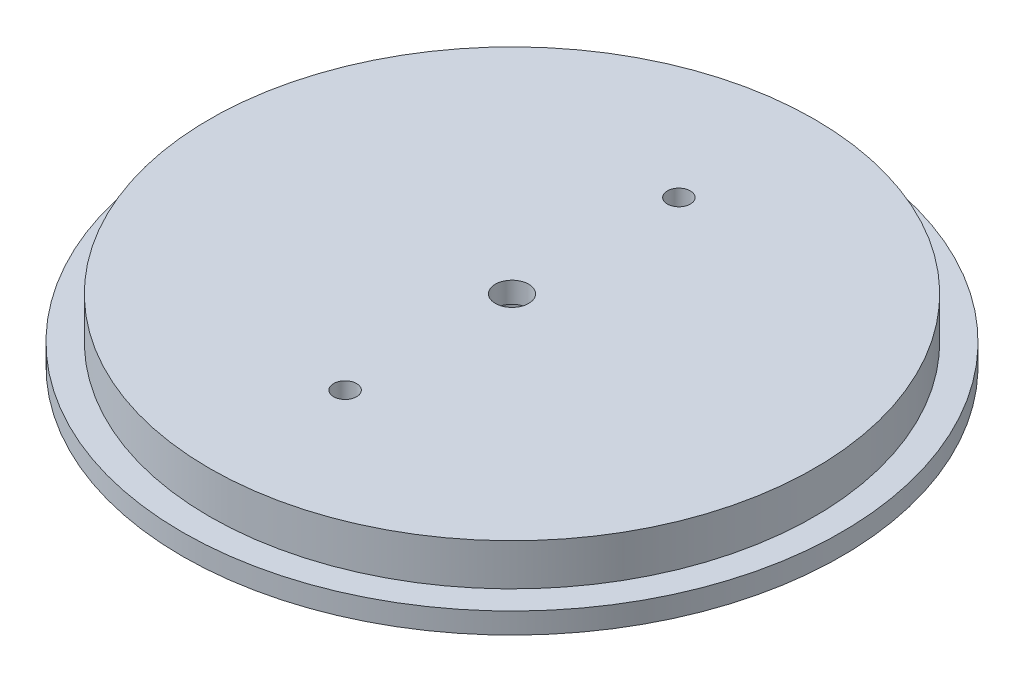
ISO-10303-21;
HEADER;
FILE_DESCRIPTION(('STEP AP214'),'2;1');
FILE_NAME('part.step','',(''),(''),'','','');
FILE_SCHEMA(('AUTOMOTIVE_DESIGN { 1 0 10303 214 1 1 1 1 }'));
ENDSEC;
DATA;
#1=APPLICATION_CONTEXT('core data for automotive mechanical design processes');
#2=APPLICATION_PROTOCOL_DEFINITION('international standard','automotive_design',2000,#1);
#3=PRODUCT_CONTEXT('',#1,'mechanical');
#4=PRODUCT('Part','Part','',(#3));
#5=PRODUCT_RELATED_PRODUCT_CATEGORY('part','',(#4));
#6=PRODUCT_DEFINITION_FORMATION('','',#4);
#7=PRODUCT_DEFINITION_CONTEXT('part definition',#1,'design');
#8=PRODUCT_DEFINITION('design','',#6,#7);
#9=PRODUCT_DEFINITION_SHAPE('','',#8);
#10=(LENGTH_UNIT() NAMED_UNIT(*) SI_UNIT(.MILLI.,.METRE.));
#11=(NAMED_UNIT(*) PLANE_ANGLE_UNIT() SI_UNIT($,.RADIAN.));
#12=(NAMED_UNIT(*) SI_UNIT($,.STERADIAN.) SOLID_ANGLE_UNIT());
#13=UNCERTAINTY_MEASURE_WITH_UNIT(LENGTH_MEASURE(1.E-05),#10,'distance_accuracy_value','');
#14=(GEOMETRIC_REPRESENTATION_CONTEXT(3) GLOBAL_UNCERTAINTY_ASSIGNED_CONTEXT((#13)) GLOBAL_UNIT_ASSIGNED_CONTEXT((#10,
#11,#12)) REPRESENTATION_CONTEXT('',''));
#15=CARTESIAN_POINT('',(0.,0.,0.));
#16=DIRECTION('',(0.,0.,1.));
#17=DIRECTION('',(1.,0.,0.));
#18=AXIS2_PLACEMENT_3D('',#15,#16,#17);
#19=CARTESIAN_POINT('',(0.,5.,0.));
#20=DIRECTION('',(0.,-1.,0.));
#21=DIRECTION('',(0.,0.,-1.));
#22=AXIS2_PLACEMENT_3D('',#19,#20,#21);
#23=CYLINDRICAL_SURFACE('',#22,79.);
#24=CARTESIAN_POINT('',(0.,5.,0.));
#25=DIRECTION('',(0.,1.,0.));
#26=DIRECTION('',(0.,0.,1.));
#27=AXIS2_PLACEMENT_3D('',#24,#25,#26);
#28=CIRCLE('',#27,79.);
#29=CARTESIAN_POINT('',(0.,5.,79.));
#30=VERTEX_POINT('',#29);
#31=EDGE_CURVE('E51',#30,#30,#28,.T.);
#32=ORIENTED_EDGE('',*,*,#31,.F.);
#33=EDGE_LOOP('',(#32));
#34=FACE_BOUND('',#33,.T.);
#35=CARTESIAN_POINT('',(0.,0.,0.));
#36=DIRECTION('',(0.,1.,0.));
#37=DIRECTION('',(0.,0.,1.));
#38=AXIS2_PLACEMENT_3D('',#35,#36,#37);
#39=CIRCLE('',#38,79.);
#40=CARTESIAN_POINT('',(0.,0.,79.));
#41=VERTEX_POINT('',#40);
#42=EDGE_CURVE('E46',#41,#41,#39,.T.);
#43=ORIENTED_EDGE('',*,*,#42,.T.);
#44=EDGE_LOOP('',(#43));
#45=FACE_BOUND('',#44,.T.);
#46=ADVANCED_FACE('F43',(#34,#45),#23,.T.);
#47=CARTESIAN_POINT('',(0.,5.,0.));
#48=DIRECTION('',(0.,1.,0.));
#49=DIRECTION('',(0.,0.,1.));
#50=AXIS2_PLACEMENT_3D('',#47,#48,#49);
#51=PLANE('',#50);
#52=CARTESIAN_POINT('',(0.,5.,0.));
#53=DIRECTION('',(0.,1.,0.));
#54=DIRECTION('',(0.,0.,1.));
#55=AXIS2_PLACEMENT_3D('',#52,#53,#54);
#56=CIRCLE('',#55,72.5);
#57=CARTESIAN_POINT('',(0.,5.,72.5));
#58=VERTEX_POINT('',#57);
#59=EDGE_CURVE('E10',#58,#58,#56,.T.);
#60=ORIENTED_EDGE('',*,*,#59,.F.);
#61=EDGE_LOOP('',(#60));
#62=FACE_BOUND('',#61,.T.);
#63=ORIENTED_EDGE('',*,*,#31,.T.);
#64=EDGE_LOOP('',(#63));
#65=FACE_BOUND('',#64,.T.);
#66=ADVANCED_FACE('F108',(#62,#65),#51,.T.);
#67=CARTESIAN_POINT('',(0.,0.,0.));
#68=DIRECTION('',(0.,1.,0.));
#69=DIRECTION('',(0.,0.,1.));
#70=AXIS2_PLACEMENT_3D('',#67,#68,#69);
#71=PLANE('',#70);
#72=CARTESIAN_POINT('',(0.,0.,0.));
#73=DIRECTION('',(0.,-1.,0.));
#74=DIRECTION('',(0.,0.,-1.));
#75=AXIS2_PLACEMENT_3D('',#72,#73,#74);
#76=CIRCLE('',#75,6.);
#77=CARTESIAN_POINT('',(0.,0.,-6.));
#78=VERTEX_POINT('',#77);
#79=EDGE_CURVE('E87',#78,#78,#76,.T.);
#80=ORIENTED_EDGE('',*,*,#79,.F.);
#81=EDGE_LOOP('',(#80));
#82=FACE_BOUND('',#81,.T.);
#83=CARTESIAN_POINT('',(0.,0.,-40.));
#84=DIRECTION('',(0.,1.,0.));
#85=DIRECTION('',(0.,0.,1.));
#86=AXIS2_PLACEMENT_3D('',#83,#84,#85);
#87=CIRCLE('',#86,2.75);
#88=CARTESIAN_POINT('',(0.,0.,-37.25));
#89=VERTEX_POINT('',#88);
#90=EDGE_CURVE('E62',#89,#89,#87,.T.);
#91=ORIENTED_EDGE('',*,*,#90,.T.);
#92=EDGE_LOOP('',(#91));
#93=FACE_BOUND('',#92,.T.);
#94=CARTESIAN_POINT('',(0.,0.,40.));
#95=DIRECTION('',(0.,1.,0.));
#96=DIRECTION('',(0.,0.,1.));
#97=AXIS2_PLACEMENT_3D('',#94,#95,#96);
#98=CIRCLE('',#97,2.75);
#99=CARTESIAN_POINT('',(0.,0.,42.75));
#100=VERTEX_POINT('',#99);
#101=EDGE_CURVE('E63',#100,#100,#98,.T.);
#102=ORIENTED_EDGE('',*,*,#101,.T.);
#103=EDGE_LOOP('',(#102));
#104=FACE_BOUND('',#103,.T.);
#105=ORIENTED_EDGE('',*,*,#42,.F.);
#106=EDGE_LOOP('',(#105));
#107=FACE_BOUND('',#106,.T.);
#108=ADVANCED_FACE('F104',(#82,#93,#104,#107),#71,.F.);
#109=CARTESIAN_POINT('',(0.,15.,0.));
#110=DIRECTION('',(0.,-1.,0.));
#111=DIRECTION('',(0.,0.,-1.));
#112=AXIS2_PLACEMENT_3D('',#109,#110,#111);
#113=CYLINDRICAL_SURFACE('',#112,72.5);
#114=CARTESIAN_POINT('',(0.,15.,0.));
#115=DIRECTION('',(0.,1.,0.));
#116=DIRECTION('',(0.,0.,1.));
#117=AXIS2_PLACEMENT_3D('',#114,#115,#116);
#118=CIRCLE('',#117,72.5);
#119=CARTESIAN_POINT('',(0.,15.,72.5));
#120=VERTEX_POINT('',#119);
#121=EDGE_CURVE('E58',#120,#120,#118,.T.);
#122=ORIENTED_EDGE('',*,*,#121,.F.);
#123=EDGE_LOOP('',(#122));
#124=FACE_BOUND('',#123,.T.);
#125=ORIENTED_EDGE('',*,*,#59,.T.);
#126=EDGE_LOOP('',(#125));
#127=FACE_BOUND('',#126,.T.);
#128=ADVANCED_FACE('F107',(#124,#127),#113,.T.);
#129=CARTESIAN_POINT('',(0.,15.,0.));
#130=DIRECTION('',(0.,1.,0.));
#131=DIRECTION('',(0.,0.,1.));
#132=AXIS2_PLACEMENT_3D('',#129,#130,#131);
#133=PLANE('',#132);
#134=CARTESIAN_POINT('',(0.,15.,0.));
#135=DIRECTION('',(0.,1.,0.));
#136=DIRECTION('',(0.,0.,1.));
#137=AXIS2_PLACEMENT_3D('',#134,#135,#136);
#138=CIRCLE('',#137,4.);
#139=CARTESIAN_POINT('',(0.,15.,4.));
#140=VERTEX_POINT('',#139);
#141=EDGE_CURVE('E68',#140,#140,#138,.T.);
#142=ORIENTED_EDGE('',*,*,#141,.F.);
#143=EDGE_LOOP('',(#142));
#144=FACE_BOUND('',#143,.T.);
#145=CARTESIAN_POINT('',(0.,15.,-40.));
#146=DIRECTION('',(0.,1.,0.));
#147=DIRECTION('',(0.,0.,1.));
#148=AXIS2_PLACEMENT_3D('',#145,#146,#147);
#149=CIRCLE('',#148,2.75);
#150=CARTESIAN_POINT('',(0.,15.,-37.25));
#151=VERTEX_POINT('',#150);
#152=EDGE_CURVE('E72',#151,#151,#149,.T.);
#153=ORIENTED_EDGE('',*,*,#152,.F.);
#154=EDGE_LOOP('',(#153));
#155=FACE_BOUND('',#154,.T.);
#156=CARTESIAN_POINT('',(0.,15.,40.));
#157=DIRECTION('',(0.,1.,0.));
#158=DIRECTION('',(0.,0.,1.));
#159=AXIS2_PLACEMENT_3D('',#156,#157,#158);
#160=CIRCLE('',#159,2.75);
#161=CARTESIAN_POINT('',(0.,15.,42.75));
#162=VERTEX_POINT('',#161);
#163=EDGE_CURVE('E67',#162,#162,#160,.T.);
#164=ORIENTED_EDGE('',*,*,#163,.F.);
#165=EDGE_LOOP('',(#164));
#166=FACE_BOUND('',#165,.T.);
#167=ORIENTED_EDGE('',*,*,#121,.T.);
#168=EDGE_LOOP('',(#167));
#169=FACE_BOUND('',#168,.T.);
#170=ADVANCED_FACE('F131',(#144,#155,#166,#169),#133,.T.);
#171=CARTESIAN_POINT('',(0.,0.,40.));
#172=DIRECTION('',(0.,1.,0.));
#173=DIRECTION('',(0.,0.,1.));
#174=AXIS2_PLACEMENT_3D('',#171,#172,#173);
#175=CYLINDRICAL_SURFACE('',#174,2.75);
#176=ORIENTED_EDGE('',*,*,#101,.F.);
#177=EDGE_LOOP('',(#176));
#178=FACE_BOUND('',#177,.T.);
#179=ORIENTED_EDGE('',*,*,#163,.T.);
#180=EDGE_LOOP('',(#179));
#181=FACE_BOUND('',#180,.T.);
#182=ADVANCED_FACE('F135',(#178,#181),#175,.F.);
#183=CARTESIAN_POINT('',(0.,0.,-40.));
#184=DIRECTION('',(0.,1.,0.));
#185=DIRECTION('',(0.,0.,1.));
#186=AXIS2_PLACEMENT_3D('',#183,#184,#185);
#187=CYLINDRICAL_SURFACE('',#186,2.75);
#188=ORIENTED_EDGE('',*,*,#90,.F.);
#189=EDGE_LOOP('',(#188));
#190=FACE_BOUND('',#189,.T.);
#191=ORIENTED_EDGE('',*,*,#152,.T.);
#192=EDGE_LOOP('',(#191));
#193=FACE_BOUND('',#192,.T.);
#194=ADVANCED_FACE('F139',(#190,#193),#187,.F.);
#195=CARTESIAN_POINT('',(0.,10.,0.));
#196=DIRECTION('',(0.,1.,0.));
#197=DIRECTION('',(0.,0.,1.));
#198=AXIS2_PLACEMENT_3D('',#195,#196,#197);
#199=CYLINDRICAL_SURFACE('',#198,4.);
#200=CARTESIAN_POINT('',(0.,10.,0.));
#201=DIRECTION('',(0.,1.,0.));
#202=DIRECTION('',(0.,0.,1.));
#203=AXIS2_PLACEMENT_3D('',#200,#201,#202);
#204=CIRCLE('',#203,4.);
#205=CARTESIAN_POINT('',(0.,10.,4.));
#206=VERTEX_POINT('',#205);
#207=EDGE_CURVE('E82',#206,#206,#204,.T.);
#208=ORIENTED_EDGE('',*,*,#207,.F.);
#209=EDGE_LOOP('',(#208));
#210=FACE_BOUND('',#209,.T.);
#211=ORIENTED_EDGE('',*,*,#141,.T.);
#212=EDGE_LOOP('',(#211));
#213=FACE_BOUND('',#212,.T.);
#214=ADVANCED_FACE('F143',(#210,#213),#199,.F.);
#215=CARTESIAN_POINT('',(0.,10.,0.));
#216=DIRECTION('',(0.,-1.,0.));
#217=DIRECTION('',(0.,0.,-1.));
#218=AXIS2_PLACEMENT_3D('',#215,#216,#217);
#219=PLANE('',#218);
#220=CARTESIAN_POINT('',(0.,10.,0.));
#221=DIRECTION('',(0.,-1.,0.));
#222=DIRECTION('',(0.,0.,-1.));
#223=AXIS2_PLACEMENT_3D('',#220,#221,#222);
#224=CIRCLE('',#223,6.);
#225=CARTESIAN_POINT('',(0.,10.,-6.));
#226=VERTEX_POINT('',#225);
#227=EDGE_CURVE('E86',#226,#226,#224,.T.);
#228=ORIENTED_EDGE('',*,*,#227,.T.);
#229=EDGE_LOOP('',(#228));
#230=FACE_BOUND('',#229,.T.);
#231=ORIENTED_EDGE('',*,*,#207,.T.);
#232=EDGE_LOOP('',(#231));
#233=FACE_BOUND('',#232,.T.);
#234=ADVANCED_FACE('F95',(#230,#233),#219,.T.);
#235=CARTESIAN_POINT('',(0.,10.,0.));
#236=DIRECTION('',(0.,-1.,0.));
#237=DIRECTION('',(0.,0.,-1.));
#238=AXIS2_PLACEMENT_3D('',#235,#236,#237);
#239=CYLINDRICAL_SURFACE('',#238,6.);
#240=ORIENTED_EDGE('',*,*,#227,.F.);
#241=EDGE_LOOP('',(#240));
#242=FACE_BOUND('',#241,.T.);
#243=ORIENTED_EDGE('',*,*,#79,.T.);
#244=EDGE_LOOP('',(#243));
#245=FACE_BOUND('',#244,.T.);
#246=ADVANCED_FACE('F98',(#242,#245),#239,.F.);
#247=CLOSED_SHELL('',(#46,#66,#108,#128,#170,#182,#194,#214,#234,#246));
#248=MANIFOLD_SOLID_BREP('B2',#247);
#249=ADVANCED_BREP_SHAPE_REPRESENTATION('',(#18,#248),#14);
#250=SHAPE_DEFINITION_REPRESENTATION(#9,#249);
ENDSEC;
END-ISO-10303-21;
